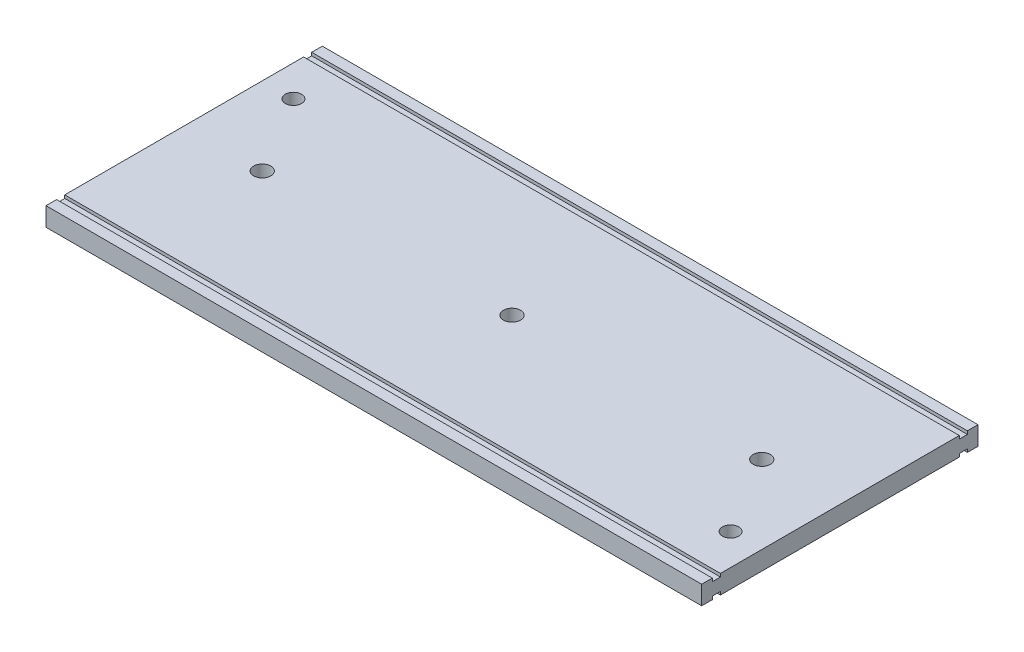
ISO-10303-21;
HEADER;
FILE_DESCRIPTION(('STEP AP214'),'2;1');
FILE_NAME('part.step','',(''),(''),'','','');
FILE_SCHEMA(('AUTOMOTIVE_DESIGN { 1 0 10303 214 1 1 1 1 }'));
ENDSEC;
DATA;
#1=APPLICATION_CONTEXT('core data for automotive mechanical design processes');
#2=APPLICATION_PROTOCOL_DEFINITION('international standard','automotive_design',2000,#1);
#3=PRODUCT_CONTEXT('',#1,'mechanical');
#4=PRODUCT('Part','Part','',(#3));
#5=PRODUCT_RELATED_PRODUCT_CATEGORY('part','',(#4));
#6=PRODUCT_DEFINITION_FORMATION('','',#4);
#7=PRODUCT_DEFINITION_CONTEXT('part definition',#1,'design');
#8=PRODUCT_DEFINITION('design','',#6,#7);
#9=PRODUCT_DEFINITION_SHAPE('','',#8);
#10=(LENGTH_UNIT() NAMED_UNIT(*) SI_UNIT(.MILLI.,.METRE.));
#11=(NAMED_UNIT(*) PLANE_ANGLE_UNIT() SI_UNIT($,.RADIAN.));
#12=(NAMED_UNIT(*) SI_UNIT($,.STERADIAN.) SOLID_ANGLE_UNIT());
#13=UNCERTAINTY_MEASURE_WITH_UNIT(LENGTH_MEASURE(1.E-05),#10,'distance_accuracy_value','');
#14=(GEOMETRIC_REPRESENTATION_CONTEXT(3) GLOBAL_UNCERTAINTY_ASSIGNED_CONTEXT((#13)) GLOBAL_UNIT_ASSIGNED_CONTEXT((#10,
#11,#12)) REPRESENTATION_CONTEXT('',''));
#15=CARTESIAN_POINT('',(0.,0.,0.));
#16=DIRECTION('',(0.,0.,1.));
#17=DIRECTION('',(1.,0.,0.));
#18=AXIS2_PLACEMENT_3D('',#15,#16,#17);
#19=CARTESIAN_POINT('',(0.,-3.,0.));
#20=DIRECTION('',(0.,-1.,0.));
#21=DIRECTION('',(0.,0.,-1.));
#22=AXIS2_PLACEMENT_3D('',#19,#20,#21);
#23=PLANE('',#22);
#24=CARTESIAN_POINT('',(-95.,-3.,-25.));
#25=DIRECTION('',(0.,1.,0.));
#26=DIRECTION('',(0.,0.,1.));
#27=AXIS2_PLACEMENT_3D('',#24,#25,#26);
#28=CIRCLE('',#27,2.6);
#29=CARTESIAN_POINT('',(-95.,-3.,-22.4));
#30=VERTEX_POINT('',#29);
#31=EDGE_CURVE('E284',#30,#30,#28,.T.);
#32=ORIENTED_EDGE('',*,*,#31,.T.);
#33=EDGE_LOOP('',(#32));
#34=FACE_BOUND('',#33,.T.);
#35=CARTESIAN_POINT('',(0.,-3.,0.));
#36=DIRECTION('',(0.,1.,0.));
#37=DIRECTION('',(0.,0.,1.));
#38=AXIS2_PLACEMENT_3D('',#35,#36,#37);
#39=CIRCLE('',#38,2.75);
#40=CARTESIAN_POINT('',(0.,-3.,2.75));
#41=VERTEX_POINT('',#40);
#42=EDGE_CURVE('E296',#41,#41,#39,.T.);
#43=ORIENTED_EDGE('',*,*,#42,.T.);
#44=EDGE_LOOP('',(#43));
#45=FACE_BOUND('',#44,.T.);
#46=CARTESIAN_POINT('',(80.,-3.,0.));
#47=DIRECTION('',(0.,1.,0.));
#48=DIRECTION('',(0.,0.,1.));
#49=AXIS2_PLACEMENT_3D('',#46,#47,#48);
#50=CIRCLE('',#49,2.75000000000001);
#51=CARTESIAN_POINT('',(80.,-3.,2.75000000000001));
#52=VERTEX_POINT('',#51);
#53=EDGE_CURVE('E302',#52,#52,#50,.T.);
#54=ORIENTED_EDGE('',*,*,#53,.T.);
#55=EDGE_LOOP('',(#54));
#56=FACE_BOUND('',#55,.T.);
#57=CARTESIAN_POINT('',(-80.,-3.,0.));
#58=DIRECTION('',(0.,1.,0.));
#59=DIRECTION('',(0.,0.,-1.));
#60=AXIS2_PLACEMENT_3D('',#57,#58,#59);
#61=CIRCLE('',#60,2.75000000000001);
#62=CARTESIAN_POINT('',(-80.,-3.,-2.75000000000001));
#63=VERTEX_POINT('',#62);
#64=EDGE_CURVE('E290',#63,#63,#61,.T.);
#65=ORIENTED_EDGE('',*,*,#64,.T.);
#66=EDGE_LOOP('',(#65));
#67=FACE_BOUND('',#66,.T.);
#68=CARTESIAN_POINT('',(95.,-3.,25.));
#69=DIRECTION('',(0.,1.,0.));
#70=DIRECTION('',(0.,0.,1.));
#71=AXIS2_PLACEMENT_3D('',#68,#69,#70);
#72=CIRCLE('',#71,2.6);
#73=CARTESIAN_POINT('',(95.,-3.,27.6));
#74=VERTEX_POINT('',#73);
#75=EDGE_CURVE('E250',#74,#74,#72,.T.);
#76=ORIENTED_EDGE('',*,*,#75,.T.);
#77=EDGE_LOOP('',(#76));
#78=FACE_BOUND('',#77,.T.);
#79=DIRECTION('',(0.,0.,1.));
#80=VECTOR('',#79,1.);
#81=CARTESIAN_POINT('',(-105.,-3.,44.25));
#82=LINE('',#81,#80);
#83=CARTESIAN_POINT('',(-105.,-3.,-38.25));
#84=VERTEX_POINT('',#83);
#85=CARTESIAN_POINT('',(-105.,-3.,38.25));
#86=VERTEX_POINT('',#85);
#87=EDGE_CURVE('E335',#84,#86,#82,.T.);
#88=ORIENTED_EDGE('',*,*,#87,.F.);
#89=DIRECTION('',(1.,0.,0.));
#90=VECTOR('',#89,1.);
#91=CARTESIAN_POINT('',(-105.,-3.,-38.25));
#92=LINE('',#91,#90);
#93=CARTESIAN_POINT('',(105.,-3.,-38.25));
#94=VERTEX_POINT('',#93);
#95=EDGE_CURVE('E192',#84,#94,#92,.T.);
#96=ORIENTED_EDGE('',*,*,#95,.T.);
#97=DIRECTION('',(0.,0.,-1.));
#98=VECTOR('',#97,1.);
#99=CARTESIAN_POINT('',(105.,-3.,44.25));
#100=LINE('',#99,#98);
#101=CARTESIAN_POINT('',(105.,-3.,38.25));
#102=VERTEX_POINT('',#101);
#103=EDGE_CURVE('E330',#102,#94,#100,.T.);
#104=ORIENTED_EDGE('',*,*,#103,.F.);
#105=DIRECTION('',(-1.,0.,0.));
#106=VECTOR('',#105,1.);
#107=CARTESIAN_POINT('',(-105.,-3.,38.25));
#108=LINE('',#107,#106);
#109=EDGE_CURVE('E207',#102,#86,#108,.T.);
#110=ORIENTED_EDGE('',*,*,#109,.T.);
#111=EDGE_LOOP('',(#88,#96,#104,#110));
#112=FACE_BOUND('',#111,.T.);
#113=ADVANCED_FACE('F37',(#34,#45,#56,#67,#78,#112),#23,.T.);
#114=CARTESIAN_POINT('',(105.,-3.,-40.85));
#115=VERTEX_POINT('',#114);
#116=CARTESIAN_POINT('',(105.,-3.,-44.25));
#117=VERTEX_POINT('',#116);
#118=EDGE_CURVE('E308',#115,#117,#100,.T.);
#119=ORIENTED_EDGE('',*,*,#118,.F.);
#120=DIRECTION('',(-1.,0.,0.));
#121=VECTOR('',#120,1.);
#122=CARTESIAN_POINT('',(-105.,-3.,-40.85));
#123=LINE('',#122,#121);
#124=CARTESIAN_POINT('',(-105.,-3.,-40.85));
#125=VERTEX_POINT('',#124);
#126=EDGE_CURVE('E223',#115,#125,#123,.T.);
#127=ORIENTED_EDGE('',*,*,#126,.T.);
#128=CARTESIAN_POINT('',(-105.,-3.,-44.25));
#129=VERTEX_POINT('',#128);
#130=EDGE_CURVE('E198',#129,#125,#82,.T.);
#131=ORIENTED_EDGE('',*,*,#130,.F.);
#132=DIRECTION('',(-1.,0.,0.));
#133=VECTOR('',#132,1.);
#134=CARTESIAN_POINT('',(-105.,-3.,-44.25));
#135=LINE('',#134,#133);
#136=EDGE_CURVE('E329',#117,#129,#135,.T.);
#137=ORIENTED_EDGE('',*,*,#136,.F.);
#138=EDGE_LOOP('',(#119,#127,#131,#137));
#139=FACE_BOUND('',#138,.T.);
#140=ADVANCED_FACE('F348',(#139),#23,.T.);
#141=CARTESIAN_POINT('',(-105.,-3.,40.85));
#142=VERTEX_POINT('',#141);
#143=CARTESIAN_POINT('',(-105.,-3.,44.25));
#144=VERTEX_POINT('',#143);
#145=EDGE_CURVE('E332',#142,#144,#82,.T.);
#146=ORIENTED_EDGE('',*,*,#145,.F.);
#147=DIRECTION('',(1.,0.,0.));
#148=VECTOR('',#147,1.);
#149=CARTESIAN_POINT('',(-105.,-3.,40.85));
#150=LINE('',#149,#148);
#151=CARTESIAN_POINT('',(105.,-3.,40.85));
#152=VERTEX_POINT('',#151);
#153=EDGE_CURVE('E216',#142,#152,#150,.T.);
#154=ORIENTED_EDGE('',*,*,#153,.T.);
#155=CARTESIAN_POINT('',(105.,-3.,44.25));
#156=VERTEX_POINT('',#155);
#157=EDGE_CURVE('E326',#156,#152,#100,.T.);
#158=ORIENTED_EDGE('',*,*,#157,.F.);
#159=DIRECTION('',(1.,0.,0.));
#160=VECTOR('',#159,1.);
#161=CARTESIAN_POINT('',(-105.,-3.,44.25));
#162=LINE('',#161,#160);
#163=EDGE_CURVE('E334',#144,#156,#162,.T.);
#164=ORIENTED_EDGE('',*,*,#163,.F.);
#165=EDGE_LOOP('',(#146,#154,#158,#164));
#166=FACE_BOUND('',#165,.T.);
#167=ADVANCED_FACE('F424',(#166),#23,.T.);
#168=CARTESIAN_POINT('',(105.,3.,44.25));
#169=DIRECTION('',(-1.,0.,0.));
#170=DIRECTION('',(0.,0.,1.));
#171=AXIS2_PLACEMENT_3D('',#168,#169,#170);
#172=PLANE('',#171);
#173=DIRECTION('',(0.,-1.,0.));
#174=VECTOR('',#173,1.);
#175=CARTESIAN_POINT('',(105.,-2.,-38.25));
#176=LINE('',#175,#174);
#177=CARTESIAN_POINT('',(105.,-2.,-38.25));
#178=VERTEX_POINT('',#177);
#179=EDGE_CURVE('E200',#178,#94,#176,.T.);
#180=ORIENTED_EDGE('',*,*,#179,.F.);
#181=DIRECTION('',(0.,0.,-1.));
#182=VECTOR('',#181,1.);
#183=CARTESIAN_POINT('',(105.,-2.,-40.85));
#184=LINE('',#183,#182);
#185=CARTESIAN_POINT('',(105.,-2.,-40.85));
#186=VERTEX_POINT('',#185);
#187=EDGE_CURVE('E185',#178,#186,#184,.T.);
#188=ORIENTED_EDGE('',*,*,#187,.T.);
#189=DIRECTION('',(0.,-1.,0.));
#190=VECTOR('',#189,1.);
#191=CARTESIAN_POINT('',(105.,-2.,-40.85));
#192=LINE('',#191,#190);
#193=EDGE_CURVE('E181',#186,#115,#192,.T.);
#194=ORIENTED_EDGE('',*,*,#193,.T.);
#195=ORIENTED_EDGE('',*,*,#118,.T.);
#196=DIRECTION('',(0.,-1.,0.));
#197=VECTOR('',#196,1.);
#198=CARTESIAN_POINT('',(105.,3.,-44.25));
#199=LINE('',#198,#197);
#200=CARTESIAN_POINT('',(105.,3.,-44.25));
#201=VERTEX_POINT('',#200);
#202=EDGE_CURVE('E11',#201,#117,#199,.T.);
#203=ORIENTED_EDGE('',*,*,#202,.F.);
#204=DIRECTION('',(0.,0.,-1.));
#205=VECTOR('',#204,1.);
#206=CARTESIAN_POINT('',(105.,3.,44.25));
#207=LINE('',#206,#205);
#208=CARTESIAN_POINT('',(105.,3.,-40.85));
#209=VERTEX_POINT('',#208);
#210=EDGE_CURVE('E316',#209,#201,#207,.T.);
#211=ORIENTED_EDGE('',*,*,#210,.F.);
#212=DIRECTION('',(0.,1.,0.));
#213=VECTOR('',#212,1.);
#214=CARTESIAN_POINT('',(105.,2.,-40.85));
#215=LINE('',#214,#213);
#216=CARTESIAN_POINT('',(105.,2.,-40.85));
#217=VERTEX_POINT('',#216);
#218=EDGE_CURVE('E251',#217,#209,#215,.T.);
#219=ORIENTED_EDGE('',*,*,#218,.F.);
#220=DIRECTION('',(0.,0.,-1.));
#221=VECTOR('',#220,1.);
#222=CARTESIAN_POINT('',(105.,2.,-40.85));
#223=LINE('',#222,#221);
#224=CARTESIAN_POINT('',(105.,2.,-38.25));
#225=VERTEX_POINT('',#224);
#226=EDGE_CURVE('E238',#225,#217,#223,.T.);
#227=ORIENTED_EDGE('',*,*,#226,.F.);
#228=DIRECTION('',(0.,1.,0.));
#229=VECTOR('',#228,1.);
#230=CARTESIAN_POINT('',(105.,2.,-38.25));
#231=LINE('',#230,#229);
#232=CARTESIAN_POINT('',(105.,3.,-38.25));
#233=VERTEX_POINT('',#232);
#234=EDGE_CURVE('E253',#225,#233,#231,.T.);
#235=ORIENTED_EDGE('',*,*,#234,.T.);
#236=CARTESIAN_POINT('',(105.,3.,38.25));
#237=VERTEX_POINT('',#236);
#238=EDGE_CURVE('E315',#237,#233,#207,.T.);
#239=ORIENTED_EDGE('',*,*,#238,.F.);
#240=DIRECTION('',(0.,1.,0.));
#241=VECTOR('',#240,1.);
#242=CARTESIAN_POINT('',(105.,2.,38.25));
#243=LINE('',#242,#241);
#244=CARTESIAN_POINT('',(105.,2.,38.25));
#245=VERTEX_POINT('',#244);
#246=EDGE_CURVE('E261',#245,#237,#243,.T.);
#247=ORIENTED_EDGE('',*,*,#246,.F.);
#248=DIRECTION('',(0.,0.,-1.));
#249=VECTOR('',#248,1.);
#250=CARTESIAN_POINT('',(105.,2.,40.85));
#251=LINE('',#250,#249);
#252=CARTESIAN_POINT('',(105.,2.,40.85));
#253=VERTEX_POINT('',#252);
#254=EDGE_CURVE('E276',#253,#245,#251,.T.);
#255=ORIENTED_EDGE('',*,*,#254,.F.);
#256=DIRECTION('',(0.,1.,0.));
#257=VECTOR('',#256,1.);
#258=CARTESIAN_POINT('',(105.,2.,40.85));
#259=LINE('',#258,#257);
#260=CARTESIAN_POINT('',(105.,3.,40.85));
#261=VERTEX_POINT('',#260);
#262=EDGE_CURVE('E257',#253,#261,#259,.T.);
#263=ORIENTED_EDGE('',*,*,#262,.T.);
#264=CARTESIAN_POINT('',(105.,3.,44.25));
#265=VERTEX_POINT('',#264);
#266=EDGE_CURVE('E311',#265,#261,#207,.T.);
#267=ORIENTED_EDGE('',*,*,#266,.F.);
#268=DIRECTION('',(0.,-1.,0.));
#269=VECTOR('',#268,1.);
#270=CARTESIAN_POINT('',(105.,3.,44.25));
#271=LINE('',#270,#269);
#272=EDGE_CURVE('E325',#265,#156,#271,.T.);
#273=ORIENTED_EDGE('',*,*,#272,.T.);
#274=ORIENTED_EDGE('',*,*,#157,.T.);
#275=DIRECTION('',(0.,-1.,0.));
#276=VECTOR('',#275,1.);
#277=CARTESIAN_POINT('',(105.,-2.,40.85));
#278=LINE('',#277,#276);
#279=CARTESIAN_POINT('',(105.,-2.,40.85));
#280=VERTEX_POINT('',#279);
#281=EDGE_CURVE('E221',#280,#152,#278,.T.);
#282=ORIENTED_EDGE('',*,*,#281,.F.);
#283=DIRECTION('',(0.,0.,-1.));
#284=VECTOR('',#283,1.);
#285=CARTESIAN_POINT('',(105.,-2.,40.85));
#286=LINE('',#285,#284);
#287=CARTESIAN_POINT('',(105.,-2.,38.25));
#288=VERTEX_POINT('',#287);
#289=EDGE_CURVE('E212',#280,#288,#286,.T.);
#290=ORIENTED_EDGE('',*,*,#289,.T.);
#291=DIRECTION('',(0.,-1.,0.));
#292=VECTOR('',#291,1.);
#293=CARTESIAN_POINT('',(105.,-2.,38.25));
#294=LINE('',#293,#292);
#295=EDGE_CURVE('E224',#288,#102,#294,.T.);
#296=ORIENTED_EDGE('',*,*,#295,.T.);
#297=ORIENTED_EDGE('',*,*,#103,.T.);
#298=EDGE_LOOP('',(#180,#188,#194,#195,#203,#211,#219,#227,#235,#239,#247,#255,#263,#267,#273,
#274,#282,#290,#296,#297));
#299=FACE_BOUND('',#298,.T.);
#300=ADVANCED_FACE('F39',(#299),#172,.F.);
#301=CARTESIAN_POINT('',(-105.,3.,44.25));
#302=DIRECTION('',(1.,0.,0.));
#303=DIRECTION('',(0.,0.,-1.));
#304=AXIS2_PLACEMENT_3D('',#301,#302,#303);
#305=PLANE('',#304);
#306=DIRECTION('',(0.,-1.,0.));
#307=VECTOR('',#306,1.);
#308=CARTESIAN_POINT('',(-105.,-2.,-38.25));
#309=LINE('',#308,#307);
#310=CARTESIAN_POINT('',(-105.,-2.,-38.25));
#311=VERTEX_POINT('',#310);
#312=EDGE_CURVE('E52',#311,#84,#309,.T.);
#313=ORIENTED_EDGE('',*,*,#312,.T.);
#314=ORIENTED_EDGE('',*,*,#87,.T.);
#315=DIRECTION('',(0.,-1.,0.));
#316=VECTOR('',#315,1.);
#317=CARTESIAN_POINT('',(-105.,-2.,38.25));
#318=LINE('',#317,#316);
#319=CARTESIAN_POINT('',(-105.,-2.,38.25));
#320=VERTEX_POINT('',#319);
#321=EDGE_CURVE('E227',#320,#86,#318,.T.);
#322=ORIENTED_EDGE('',*,*,#321,.F.);
#323=DIRECTION('',(0.,0.,1.));
#324=VECTOR('',#323,1.);
#325=CARTESIAN_POINT('',(-105.,-2.,40.85));
#326=LINE('',#325,#324);
#327=CARTESIAN_POINT('',(-105.,-2.,40.85));
#328=VERTEX_POINT('',#327);
#329=EDGE_CURVE('E206',#320,#328,#326,.T.);
#330=ORIENTED_EDGE('',*,*,#329,.T.);
#331=DIRECTION('',(0.,-1.,0.));
#332=VECTOR('',#331,1.);
#333=CARTESIAN_POINT('',(-105.,-2.,40.85));
#334=LINE('',#333,#332);
#335=EDGE_CURVE('E215',#328,#142,#334,.T.);
#336=ORIENTED_EDGE('',*,*,#335,.T.);
#337=ORIENTED_EDGE('',*,*,#145,.T.);
#338=DIRECTION('',(0.,-1.,0.));
#339=VECTOR('',#338,1.);
#340=CARTESIAN_POINT('',(-105.,3.,44.25));
#341=LINE('',#340,#339);
#342=CARTESIAN_POINT('',(-105.,3.,44.25));
#343=VERTEX_POINT('',#342);
#344=EDGE_CURVE('E339',#343,#144,#341,.T.);
#345=ORIENTED_EDGE('',*,*,#344,.F.);
#346=DIRECTION('',(0.,0.,1.));
#347=VECTOR('',#346,1.);
#348=CARTESIAN_POINT('',(-105.,3.,44.25));
#349=LINE('',#348,#347);
#350=CARTESIAN_POINT('',(-105.,3.,40.85));
#351=VERTEX_POINT('',#350);
#352=EDGE_CURVE('E318',#351,#343,#349,.T.);
#353=ORIENTED_EDGE('',*,*,#352,.F.);
#354=DIRECTION('',(0.,1.,0.));
#355=VECTOR('',#354,1.);
#356=CARTESIAN_POINT('',(-105.,2.,40.85));
#357=LINE('',#356,#355);
#358=CARTESIAN_POINT('',(-105.,2.,40.85));
#359=VERTEX_POINT('',#358);
#360=EDGE_CURVE('E266',#359,#351,#357,.T.);
#361=ORIENTED_EDGE('',*,*,#360,.F.);
#362=DIRECTION('',(0.,0.,1.));
#363=VECTOR('',#362,1.);
#364=CARTESIAN_POINT('',(-105.,2.,40.85));
#365=LINE('',#364,#363);
#366=CARTESIAN_POINT('',(-105.,2.,38.25));
#367=VERTEX_POINT('',#366);
#368=EDGE_CURVE('E260',#367,#359,#365,.T.);
#369=ORIENTED_EDGE('',*,*,#368,.F.);
#370=DIRECTION('',(0.,1.,0.));
#371=VECTOR('',#370,1.);
#372=CARTESIAN_POINT('',(-105.,2.,38.25));
#373=LINE('',#372,#371);
#374=CARTESIAN_POINT('',(-105.,3.,38.25));
#375=VERTEX_POINT('',#374);
#376=EDGE_CURVE('E263',#367,#375,#373,.T.);
#377=ORIENTED_EDGE('',*,*,#376,.T.);
#378=CARTESIAN_POINT('',(-105.,3.,-38.25));
#379=VERTEX_POINT('',#378);
#380=EDGE_CURVE('E323',#379,#375,#349,.T.);
#381=ORIENTED_EDGE('',*,*,#380,.F.);
#382=DIRECTION('',(0.,1.,0.));
#383=VECTOR('',#382,1.);
#384=CARTESIAN_POINT('',(-105.,2.,-38.25));
#385=LINE('',#384,#383);
#386=CARTESIAN_POINT('',(-105.,2.,-38.25));
#387=VERTEX_POINT('',#386);
#388=EDGE_CURVE('E242',#387,#379,#385,.T.);
#389=ORIENTED_EDGE('',*,*,#388,.F.);
#390=DIRECTION('',(0.,0.,1.));
#391=VECTOR('',#390,1.);
#392=CARTESIAN_POINT('',(-105.,2.,-40.85));
#393=LINE('',#392,#391);
#394=CARTESIAN_POINT('',(-105.,2.,-40.85));
#395=VERTEX_POINT('',#394);
#396=EDGE_CURVE('E231',#395,#387,#393,.T.);
#397=ORIENTED_EDGE('',*,*,#396,.F.);
#398=DIRECTION('',(0.,1.,0.));
#399=VECTOR('',#398,1.);
#400=CARTESIAN_POINT('',(-105.,2.,-40.85));
#401=LINE('',#400,#399);
#402=CARTESIAN_POINT('',(-105.,3.,-40.85));
#403=VERTEX_POINT('',#402);
#404=EDGE_CURVE('E247',#395,#403,#401,.T.);
#405=ORIENTED_EDGE('',*,*,#404,.T.);
#406=CARTESIAN_POINT('',(-105.,3.,-44.25));
#407=VERTEX_POINT('',#406);
#408=EDGE_CURVE('E319',#407,#403,#349,.T.);
#409=ORIENTED_EDGE('',*,*,#408,.F.);
#410=DIRECTION('',(0.,-1.,0.));
#411=VECTOR('',#410,1.);
#412=CARTESIAN_POINT('',(-105.,3.,-44.25));
#413=LINE('',#412,#411);
#414=EDGE_CURVE('E45',#407,#129,#413,.T.);
#415=ORIENTED_EDGE('',*,*,#414,.T.);
#416=ORIENTED_EDGE('',*,*,#130,.T.);
#417=DIRECTION('',(0.,-1.,0.));
#418=VECTOR('',#417,1.);
#419=CARTESIAN_POINT('',(-105.,-2.,-40.85));
#420=LINE('',#419,#418);
#421=CARTESIAN_POINT('',(-105.,-2.,-40.85));
#422=VERTEX_POINT('',#421);
#423=EDGE_CURVE('E178',#422,#125,#420,.T.);
#424=ORIENTED_EDGE('',*,*,#423,.F.);
#425=DIRECTION('',(0.,0.,1.));
#426=VECTOR('',#425,1.);
#427=CARTESIAN_POINT('',(-105.,-2.,-40.85));
#428=LINE('',#427,#426);
#429=EDGE_CURVE('E186',#422,#311,#428,.T.);
#430=ORIENTED_EDGE('',*,*,#429,.T.);
#431=EDGE_LOOP('',(#313,#314,#322,#330,#336,#337,#345,#353,#361,#369,#377,#381,#389,#397,#405,
#409,#415,#416,#424,#430));
#432=FACE_BOUND('',#431,.T.);
#433=ADVANCED_FACE('F195',(#432),#305,.F.);
#434=CARTESIAN_POINT('',(0.,3.,0.));
#435=DIRECTION('',(0.,-1.,0.));
#436=DIRECTION('',(0.,0.,-1.));
#437=AXIS2_PLACEMENT_3D('',#434,#435,#436);
#438=PLANE('',#437);
#439=ORIENTED_EDGE('',*,*,#408,.T.);
#440=DIRECTION('',(-1.,0.,0.));
#441=VECTOR('',#440,1.);
#442=CARTESIAN_POINT('',(-105.,3.,-40.85));
#443=LINE('',#442,#441);
#444=EDGE_CURVE('E235',#209,#403,#443,.T.);
#445=ORIENTED_EDGE('',*,*,#444,.F.);
#446=ORIENTED_EDGE('',*,*,#210,.T.);
#447=DIRECTION('',(-1.,0.,0.));
#448=VECTOR('',#447,1.);
#449=CARTESIAN_POINT('',(-105.,3.,-44.25));
#450=LINE('',#449,#448);
#451=EDGE_CURVE('E314',#201,#407,#450,.T.);
#452=ORIENTED_EDGE('',*,*,#451,.T.);
#453=EDGE_LOOP('',(#439,#445,#446,#452));
#454=FACE_BOUND('',#453,.T.);
#455=ADVANCED_FACE('F367',(#454),#438,.F.);
#456=ORIENTED_EDGE('',*,*,#266,.T.);
#457=DIRECTION('',(1.,0.,0.));
#458=VECTOR('',#457,1.);
#459=CARTESIAN_POINT('',(-105.,3.,40.85));
#460=LINE('',#459,#458);
#461=EDGE_CURVE('E245',#351,#261,#460,.T.);
#462=ORIENTED_EDGE('',*,*,#461,.F.);
#463=ORIENTED_EDGE('',*,*,#352,.T.);
#464=DIRECTION('',(1.,0.,0.));
#465=VECTOR('',#464,1.);
#466=CARTESIAN_POINT('',(-105.,3.,44.25));
#467=LINE('',#466,#465);
#468=EDGE_CURVE('E322',#343,#265,#467,.T.);
#469=ORIENTED_EDGE('',*,*,#468,.T.);
#470=EDGE_LOOP('',(#456,#462,#463,#469));
#471=FACE_BOUND('',#470,.T.);
#472=ADVANCED_FACE('F395',(#471),#438,.F.);
#473=ORIENTED_EDGE('',*,*,#238,.T.);
#474=DIRECTION('',(1.,0.,0.));
#475=VECTOR('',#474,1.);
#476=CARTESIAN_POINT('',(-105.,3.,-38.25));
#477=LINE('',#476,#475);
#478=EDGE_CURVE('E243',#379,#233,#477,.T.);
#479=ORIENTED_EDGE('',*,*,#478,.F.);
#480=ORIENTED_EDGE('',*,*,#380,.T.);
#481=DIRECTION('',(-1.,0.,0.));
#482=VECTOR('',#481,1.);
#483=CARTESIAN_POINT('',(-105.,3.,38.25));
#484=LINE('',#483,#482);
#485=EDGE_CURVE('E268',#237,#375,#484,.T.);
#486=ORIENTED_EDGE('',*,*,#485,.F.);
#487=EDGE_LOOP('',(#473,#479,#480,#486));
#488=FACE_BOUND('',#487,.T.);
#489=CARTESIAN_POINT('',(80.,3.,0.));
#490=DIRECTION('',(0.,1.,0.));
#491=DIRECTION('',(0.,0.,1.));
#492=AXIS2_PLACEMENT_3D('',#489,#490,#491);
#493=CIRCLE('',#492,2.75000000000001);
#494=CARTESIAN_POINT('',(80.,3.,2.75000000000001));
#495=VERTEX_POINT('',#494);
#496=EDGE_CURVE('E305',#495,#495,#493,.T.);
#497=ORIENTED_EDGE('',*,*,#496,.F.);
#498=EDGE_LOOP('',(#497));
#499=FACE_BOUND('',#498,.T.);
#500=CARTESIAN_POINT('',(0.,3.,0.));
#501=DIRECTION('',(0.,1.,0.));
#502=DIRECTION('',(0.,0.,1.));
#503=AXIS2_PLACEMENT_3D('',#500,#501,#502);
#504=CIRCLE('',#503,2.75);
#505=CARTESIAN_POINT('',(0.,3.,2.75));
#506=VERTEX_POINT('',#505);
#507=EDGE_CURVE('E299',#506,#506,#504,.T.);
#508=ORIENTED_EDGE('',*,*,#507,.F.);
#509=EDGE_LOOP('',(#508));
#510=FACE_BOUND('',#509,.T.);
#511=CARTESIAN_POINT('',(-80.,3.,0.));
#512=DIRECTION('',(0.,1.,0.));
#513=DIRECTION('',(0.,0.,-1.));
#514=AXIS2_PLACEMENT_3D('',#511,#512,#513);
#515=CIRCLE('',#514,2.75000000000001);
#516=CARTESIAN_POINT('',(-80.,3.,-2.75000000000001));
#517=VERTEX_POINT('',#516);
#518=EDGE_CURVE('E293',#517,#517,#515,.T.);
#519=ORIENTED_EDGE('',*,*,#518,.F.);
#520=EDGE_LOOP('',(#519));
#521=FACE_BOUND('',#520,.T.);
#522=CARTESIAN_POINT('',(-95.,3.,-25.));
#523=DIRECTION('',(0.,1.,0.));
#524=DIRECTION('',(0.,0.,1.));
#525=AXIS2_PLACEMENT_3D('',#522,#523,#524);
#526=CIRCLE('',#525,2.6);
#527=CARTESIAN_POINT('',(-95.,3.,-22.4));
#528=VERTEX_POINT('',#527);
#529=EDGE_CURVE('E287',#528,#528,#526,.T.);
#530=ORIENTED_EDGE('',*,*,#529,.F.);
#531=EDGE_LOOP('',(#530));
#532=FACE_BOUND('',#531,.T.);
#533=CARTESIAN_POINT('',(95.,3.,25.));
#534=DIRECTION('',(0.,1.,0.));
#535=DIRECTION('',(0.,0.,1.));
#536=AXIS2_PLACEMENT_3D('',#533,#534,#535);
#537=CIRCLE('',#536,2.6);
#538=CARTESIAN_POINT('',(95.,3.,27.6));
#539=VERTEX_POINT('',#538);
#540=EDGE_CURVE('E281',#539,#539,#537,.T.);
#541=ORIENTED_EDGE('',*,*,#540,.F.);
#542=EDGE_LOOP('',(#541));
#543=FACE_BOUND('',#542,.T.);
#544=ADVANCED_FACE('F374',(#488,#499,#510,#521,#532,#543),#438,.F.);
#545=CARTESIAN_POINT('',(-105.,3.,-44.25));
#546=DIRECTION('',(0.,0.,1.));
#547=DIRECTION('',(1.,0.,0.));
#548=AXIS2_PLACEMENT_3D('',#545,#546,#547);
#549=PLANE('',#548);
#550=ORIENTED_EDGE('',*,*,#136,.T.);
#551=ORIENTED_EDGE('',*,*,#414,.F.);
#552=ORIENTED_EDGE('',*,*,#451,.F.);
#553=ORIENTED_EDGE('',*,*,#202,.T.);
#554=EDGE_LOOP('',(#550,#551,#552,#553));
#555=FACE_BOUND('',#554,.T.);
#556=ADVANCED_FACE('F365',(#555),#549,.F.);
#557=CARTESIAN_POINT('',(-105.,3.,44.25));
#558=DIRECTION('',(0.,0.,-1.));
#559=DIRECTION('',(-1.,0.,0.));
#560=AXIS2_PLACEMENT_3D('',#557,#558,#559);
#561=PLANE('',#560);
#562=ORIENTED_EDGE('',*,*,#163,.T.);
#563=ORIENTED_EDGE('',*,*,#272,.F.);
#564=ORIENTED_EDGE('',*,*,#468,.F.);
#565=ORIENTED_EDGE('',*,*,#344,.T.);
#566=EDGE_LOOP('',(#562,#563,#564,#565));
#567=FACE_BOUND('',#566,.T.);
#568=ADVANCED_FACE('F402',(#567),#561,.F.);
#569=CARTESIAN_POINT('',(80.,3.,0.));
#570=DIRECTION('',(0.,-1.,0.));
#571=DIRECTION('',(0.,0.,-1.));
#572=AXIS2_PLACEMENT_3D('',#569,#570,#571);
#573=CYLINDRICAL_SURFACE('',#572,2.75000000000001);
#574=ORIENTED_EDGE('',*,*,#496,.T.);
#575=EDGE_LOOP('',(#574));
#576=FACE_BOUND('',#575,.T.);
#577=ORIENTED_EDGE('',*,*,#53,.F.);
#578=EDGE_LOOP('',(#577));
#579=FACE_BOUND('',#578,.T.);
#580=ADVANCED_FACE('F633',(#576,#579),#573,.F.);
#581=CARTESIAN_POINT('',(0.,3.,0.));
#582=DIRECTION('',(0.,-1.,0.));
#583=DIRECTION('',(0.,0.,-1.));
#584=AXIS2_PLACEMENT_3D('',#581,#582,#583);
#585=CYLINDRICAL_SURFACE('',#584,2.75);
#586=ORIENTED_EDGE('',*,*,#507,.T.);
#587=EDGE_LOOP('',(#586));
#588=FACE_BOUND('',#587,.T.);
#589=ORIENTED_EDGE('',*,*,#42,.F.);
#590=EDGE_LOOP('',(#589));
#591=FACE_BOUND('',#590,.T.);
#592=ADVANCED_FACE('F623',(#588,#591),#585,.F.);
#593=CARTESIAN_POINT('',(-80.,3.,0.));
#594=DIRECTION('',(0.,-1.,0.));
#595=DIRECTION('',(0.,0.,-1.));
#596=AXIS2_PLACEMENT_3D('',#593,#594,#595);
#597=CYLINDRICAL_SURFACE('',#596,2.75000000000001);
#598=ORIENTED_EDGE('',*,*,#518,.T.);
#599=EDGE_LOOP('',(#598));
#600=FACE_BOUND('',#599,.T.);
#601=ORIENTED_EDGE('',*,*,#64,.F.);
#602=EDGE_LOOP('',(#601));
#603=FACE_BOUND('',#602,.T.);
#604=ADVANCED_FACE('F613',(#600,#603),#597,.F.);
#605=CARTESIAN_POINT('',(-95.,3.,-25.));
#606=DIRECTION('',(0.,-1.,0.));
#607=DIRECTION('',(0.,0.,-1.));
#608=AXIS2_PLACEMENT_3D('',#605,#606,#607);
#609=CYLINDRICAL_SURFACE('',#608,2.6);
#610=ORIENTED_EDGE('',*,*,#529,.T.);
#611=EDGE_LOOP('',(#610));
#612=FACE_BOUND('',#611,.T.);
#613=ORIENTED_EDGE('',*,*,#31,.F.);
#614=EDGE_LOOP('',(#613));
#615=FACE_BOUND('',#614,.T.);
#616=ADVANCED_FACE('F604',(#612,#615),#609,.F.);
#617=CARTESIAN_POINT('',(95.,3.,25.));
#618=DIRECTION('',(0.,-1.,0.));
#619=DIRECTION('',(0.,0.,-1.));
#620=AXIS2_PLACEMENT_3D('',#617,#618,#619);
#621=CYLINDRICAL_SURFACE('',#620,2.6);
#622=ORIENTED_EDGE('',*,*,#540,.T.);
#623=EDGE_LOOP('',(#622));
#624=FACE_BOUND('',#623,.T.);
#625=ORIENTED_EDGE('',*,*,#75,.F.);
#626=EDGE_LOOP('',(#625));
#627=FACE_BOUND('',#626,.T.);
#628=ADVANCED_FACE('F419',(#624,#627),#621,.F.);
#629=CARTESIAN_POINT('',(-105.,2.,40.85));
#630=DIRECTION('',(0.,0.,1.));
#631=DIRECTION('',(1.,0.,0.));
#632=AXIS2_PLACEMENT_3D('',#629,#630,#631);
#633=PLANE('',#632);
#634=ORIENTED_EDGE('',*,*,#461,.T.);
#635=ORIENTED_EDGE('',*,*,#262,.F.);
#636=DIRECTION('',(1.,0.,0.));
#637=VECTOR('',#636,1.);
#638=CARTESIAN_POINT('',(-105.,2.,40.85));
#639=LINE('',#638,#637);
#640=EDGE_CURVE('E270',#359,#253,#639,.T.);
#641=ORIENTED_EDGE('',*,*,#640,.F.);
#642=ORIENTED_EDGE('',*,*,#360,.T.);
#643=EDGE_LOOP('',(#634,#635,#641,#642));
#644=FACE_BOUND('',#643,.T.);
#645=ADVANCED_FACE('F406',(#644),#633,.F.);
#646=CARTESIAN_POINT('',(-105.,2.,38.25));
#647=DIRECTION('',(0.,0.,-1.));
#648=DIRECTION('',(-1.,0.,0.));
#649=AXIS2_PLACEMENT_3D('',#646,#647,#648);
#650=PLANE('',#649);
#651=ORIENTED_EDGE('',*,*,#485,.T.);
#652=ORIENTED_EDGE('',*,*,#376,.F.);
#653=DIRECTION('',(-1.,0.,0.));
#654=VECTOR('',#653,1.);
#655=CARTESIAN_POINT('',(-105.,2.,38.25));
#656=LINE('',#655,#654);
#657=EDGE_CURVE('E274',#245,#367,#656,.T.);
#658=ORIENTED_EDGE('',*,*,#657,.F.);
#659=ORIENTED_EDGE('',*,*,#246,.T.);
#660=EDGE_LOOP('',(#651,#652,#658,#659));
#661=FACE_BOUND('',#660,.T.);
#662=ADVANCED_FACE('F410',(#661),#650,.F.);
#663=CARTESIAN_POINT('',(0.,2.,0.));
#664=DIRECTION('',(0.,1.,0.));
#665=DIRECTION('',(0.,0.,1.));
#666=AXIS2_PLACEMENT_3D('',#663,#664,#665);
#667=PLANE('',#666);
#668=ORIENTED_EDGE('',*,*,#640,.T.);
#669=ORIENTED_EDGE('',*,*,#254,.T.);
#670=ORIENTED_EDGE('',*,*,#657,.T.);
#671=ORIENTED_EDGE('',*,*,#368,.T.);
#672=EDGE_LOOP('',(#668,#669,#670,#671));
#673=FACE_BOUND('',#672,.T.);
#674=ADVANCED_FACE('F408',(#673),#667,.T.);
#675=CARTESIAN_POINT('',(-105.,2.,-40.85));
#676=DIRECTION('',(0.,0.,-1.));
#677=DIRECTION('',(-1.,0.,0.));
#678=AXIS2_PLACEMENT_3D('',#675,#676,#677);
#679=PLANE('',#678);
#680=ORIENTED_EDGE('',*,*,#444,.T.);
#681=ORIENTED_EDGE('',*,*,#404,.F.);
#682=DIRECTION('',(-1.,0.,0.));
#683=VECTOR('',#682,1.);
#684=CARTESIAN_POINT('',(-105.,2.,-40.85));
#685=LINE('',#684,#683);
#686=EDGE_CURVE('E240',#217,#395,#685,.T.);
#687=ORIENTED_EDGE('',*,*,#686,.F.);
#688=ORIENTED_EDGE('',*,*,#218,.T.);
#689=EDGE_LOOP('',(#680,#681,#687,#688));
#690=FACE_BOUND('',#689,.T.);
#691=ADVANCED_FACE('F417',(#690),#679,.F.);
#692=CARTESIAN_POINT('',(-105.,2.,-38.25));
#693=DIRECTION('',(0.,0.,1.));
#694=DIRECTION('',(1.,0.,0.));
#695=AXIS2_PLACEMENT_3D('',#692,#693,#694);
#696=PLANE('',#695);
#697=ORIENTED_EDGE('',*,*,#478,.T.);
#698=ORIENTED_EDGE('',*,*,#234,.F.);
#699=DIRECTION('',(1.,0.,0.));
#700=VECTOR('',#699,1.);
#701=CARTESIAN_POINT('',(-105.,2.,-38.25));
#702=LINE('',#701,#700);
#703=EDGE_CURVE('E234',#387,#225,#702,.T.);
#704=ORIENTED_EDGE('',*,*,#703,.F.);
#705=ORIENTED_EDGE('',*,*,#388,.T.);
#706=EDGE_LOOP('',(#697,#698,#704,#705));
#707=FACE_BOUND('',#706,.T.);
#708=ADVANCED_FACE('F382',(#707),#696,.F.);
#709=CARTESIAN_POINT('',(0.,2.,0.));
#710=DIRECTION('',(0.,1.,0.));
#711=DIRECTION('',(0.,0.,1.));
#712=AXIS2_PLACEMENT_3D('',#709,#710,#711);
#713=PLANE('',#712);
#714=ORIENTED_EDGE('',*,*,#396,.T.);
#715=ORIENTED_EDGE('',*,*,#703,.T.);
#716=ORIENTED_EDGE('',*,*,#226,.T.);
#717=ORIENTED_EDGE('',*,*,#686,.T.);
#718=EDGE_LOOP('',(#714,#715,#716,#717));
#719=FACE_BOUND('',#718,.T.);
#720=ADVANCED_FACE('F384',(#719),#713,.T.);
#721=CARTESIAN_POINT('',(-105.,-2.,40.85));
#722=DIRECTION('',(0.,0.,-1.));
#723=DIRECTION('',(-1.,0.,0.));
#724=AXIS2_PLACEMENT_3D('',#721,#722,#723);
#725=PLANE('',#724);
#726=ORIENTED_EDGE('',*,*,#153,.F.);
#727=ORIENTED_EDGE('',*,*,#335,.F.);
#728=DIRECTION('',(1.,0.,0.));
#729=VECTOR('',#728,1.);
#730=CARTESIAN_POINT('',(-105.,-2.,40.85));
#731=LINE('',#730,#729);
#732=EDGE_CURVE('E60',#328,#280,#731,.T.);
#733=ORIENTED_EDGE('',*,*,#732,.T.);
#734=ORIENTED_EDGE('',*,*,#281,.T.);
#735=EDGE_LOOP('',(#726,#727,#733,#734));
#736=FACE_BOUND('',#735,.T.);
#737=ADVANCED_FACE('F448',(#736),#725,.T.);
#738=CARTESIAN_POINT('',(-105.,-2.,38.25));
#739=DIRECTION('',(0.,0.,1.));
#740=DIRECTION('',(1.,0.,0.));
#741=AXIS2_PLACEMENT_3D('',#738,#739,#740);
#742=PLANE('',#741);
#743=ORIENTED_EDGE('',*,*,#109,.F.);
#744=ORIENTED_EDGE('',*,*,#295,.F.);
#745=DIRECTION('',(-1.,0.,0.));
#746=VECTOR('',#745,1.);
#747=CARTESIAN_POINT('',(-105.,-2.,38.25));
#748=LINE('',#747,#746);
#749=EDGE_CURVE('E210',#288,#320,#748,.T.);
#750=ORIENTED_EDGE('',*,*,#749,.T.);
#751=ORIENTED_EDGE('',*,*,#321,.T.);
#752=EDGE_LOOP('',(#743,#744,#750,#751));
#753=FACE_BOUND('',#752,.T.);
#754=ADVANCED_FACE('F438',(#753),#742,.T.);
#755=CARTESIAN_POINT('',(0.,-2.,0.));
#756=DIRECTION('',(0.,-1.,0.));
#757=DIRECTION('',(0.,0.,1.));
#758=AXIS2_PLACEMENT_3D('',#755,#756,#757);
#759=PLANE('',#758);
#760=ORIENTED_EDGE('',*,*,#732,.F.);
#761=ORIENTED_EDGE('',*,*,#329,.F.);
#762=ORIENTED_EDGE('',*,*,#749,.F.);
#763=ORIENTED_EDGE('',*,*,#289,.F.);
#764=EDGE_LOOP('',(#760,#761,#762,#763));
#765=FACE_BOUND('',#764,.T.);
#766=ADVANCED_FACE('F440',(#765),#759,.T.);
#767=CARTESIAN_POINT('',(-105.,-2.,-38.25));
#768=DIRECTION('',(0.,0.,-1.));
#769=DIRECTION('',(-1.,0.,0.));
#770=AXIS2_PLACEMENT_3D('',#767,#768,#769);
#771=PLANE('',#770);
#772=ORIENTED_EDGE('',*,*,#95,.F.);
#773=ORIENTED_EDGE('',*,*,#312,.F.);
#774=DIRECTION('',(1.,0.,0.));
#775=VECTOR('',#774,1.);
#776=CARTESIAN_POINT('',(-105.,-2.,-38.25));
#777=LINE('',#776,#775);
#778=EDGE_CURVE('E190',#311,#178,#777,.T.);
#779=ORIENTED_EDGE('',*,*,#778,.T.);
#780=ORIENTED_EDGE('',*,*,#179,.T.);
#781=EDGE_LOOP('',(#772,#773,#779,#780));
#782=FACE_BOUND('',#781,.T.);
#783=ADVANCED_FACE('F355',(#782),#771,.T.);
#784=CARTESIAN_POINT('',(-105.,-2.,-40.85));
#785=DIRECTION('',(0.,0.,1.));
#786=DIRECTION('',(1.,0.,0.));
#787=AXIS2_PLACEMENT_3D('',#784,#785,#786);
#788=PLANE('',#787);
#789=ORIENTED_EDGE('',*,*,#126,.F.);
#790=ORIENTED_EDGE('',*,*,#193,.F.);
#791=DIRECTION('',(-1.,0.,0.));
#792=VECTOR('',#791,1.);
#793=CARTESIAN_POINT('',(-105.,-2.,-40.85));
#794=LINE('',#793,#792);
#795=EDGE_CURVE('E174',#186,#422,#794,.T.);
#796=ORIENTED_EDGE('',*,*,#795,.T.);
#797=ORIENTED_EDGE('',*,*,#423,.T.);
#798=EDGE_LOOP('',(#789,#790,#796,#797));
#799=FACE_BOUND('',#798,.T.);
#800=ADVANCED_FACE('F176',(#799),#788,.T.);
#801=CARTESIAN_POINT('',(0.,-2.,0.));
#802=DIRECTION('',(0.,-1.,0.));
#803=DIRECTION('',(0.,0.,1.));
#804=AXIS2_PLACEMENT_3D('',#801,#802,#803);
#805=PLANE('',#804);
#806=ORIENTED_EDGE('',*,*,#429,.F.);
#807=ORIENTED_EDGE('',*,*,#795,.F.);
#808=ORIENTED_EDGE('',*,*,#187,.F.);
#809=ORIENTED_EDGE('',*,*,#778,.F.);
#810=EDGE_LOOP('',(#806,#807,#808,#809));
#811=FACE_BOUND('',#810,.T.);
#812=ADVANCED_FACE('F189',(#811),#805,.T.);
#813=CLOSED_SHELL('',(#113,#140,#167,#300,#433,#455,#472,#544,#556,#568,#580,#592,#604,#616,
#628,#645,#662,#674,#691,#708,#720,#737,#754,#766,#783,#800,#812));
#814=MANIFOLD_SOLID_BREP('B2',#813);
#815=ADVANCED_BREP_SHAPE_REPRESENTATION('',(#18,#814),#14);
#816=SHAPE_DEFINITION_REPRESENTATION(#9,#815);
ENDSEC;
END-ISO-10303-21;
